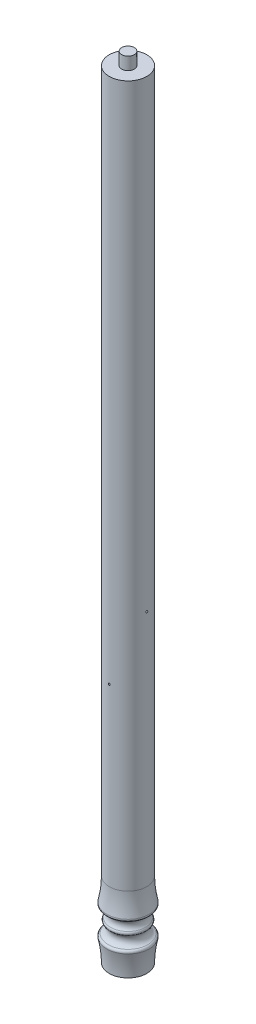
ISO-10303-21;
HEADER;
FILE_DESCRIPTION(('STEP AP214'),'2;1');
FILE_NAME('part.step','',(''),(''),'','','');
FILE_SCHEMA(('AUTOMOTIVE_DESIGN { 1 0 10303 214 1 1 1 1 }'));
ENDSEC;
DATA;
#1=APPLICATION_CONTEXT('core data for automotive mechanical design processes');
#2=APPLICATION_PROTOCOL_DEFINITION('international standard','automotive_design',2000,#1);
#3=PRODUCT_CONTEXT('',#1,'mechanical');
#4=PRODUCT('Part','Part','',(#3));
#5=PRODUCT_RELATED_PRODUCT_CATEGORY('part','',(#4));
#6=PRODUCT_DEFINITION_FORMATION('','',#4);
#7=PRODUCT_DEFINITION_CONTEXT('part definition',#1,'design');
#8=PRODUCT_DEFINITION('design','',#6,#7);
#9=PRODUCT_DEFINITION_SHAPE('','',#8);
#10=(LENGTH_UNIT() NAMED_UNIT(*) SI_UNIT(.MILLI.,.METRE.));
#11=(NAMED_UNIT(*) PLANE_ANGLE_UNIT() SI_UNIT($,.RADIAN.));
#12=(NAMED_UNIT(*) SI_UNIT($,.STERADIAN.) SOLID_ANGLE_UNIT());
#13=UNCERTAINTY_MEASURE_WITH_UNIT(LENGTH_MEASURE(1.E-05),#10,'distance_accuracy_value','');
#14=(GEOMETRIC_REPRESENTATION_CONTEXT(3) GLOBAL_UNCERTAINTY_ASSIGNED_CONTEXT((#13)) GLOBAL_UNIT_ASSIGNED_CONTEXT((#10,
#11,#12)) REPRESENTATION_CONTEXT('',''));
#15=CARTESIAN_POINT('',(0.,0.,0.));
#16=DIRECTION('',(0.,0.,1.));
#17=DIRECTION('',(1.,0.,0.));
#18=AXIS2_PLACEMENT_3D('',#15,#16,#17);
#19=CARTESIAN_POINT('',(6.35,800.1,0.));
#20=DIRECTION('',(0.,1.,0.));
#21=DIRECTION('',(0.,0.,1.));
#22=AXIS2_PLACEMENT_3D('',#19,#20,#21);
#23=PLANE('',#22);
#24=CARTESIAN_POINT('',(0.,800.1,0.));
#25=DIRECTION('',(0.,-1.,0.));
#26=DIRECTION('',(0.,0.,-1.));
#27=AXIS2_PLACEMENT_3D('',#24,#25,#26);
#28=CIRCLE('',#27,6.35);
#29=CARTESIAN_POINT('',(0.,800.1,-6.35));
#30=VERTEX_POINT('',#29);
#31=EDGE_CURVE('E45',#30,#30,#28,.T.);
#32=ORIENTED_EDGE('',*,*,#31,.F.);
#33=EDGE_LOOP('',(#32));
#34=FACE_BOUND('',#33,.T.);
#35=ADVANCED_FACE('F30',(#34),#23,.T.);
#36=CARTESIAN_POINT('',(0.,-55.,0.));
#37=DIRECTION('',(0.,-1.,0.));
#38=DIRECTION('',(0.,0.,-1.));
#39=AXIS2_PLACEMENT_3D('',#36,#37,#38);
#40=CYLINDRICAL_SURFACE('',#39,6.35);
#41=ORIENTED_EDGE('',*,*,#31,.T.);
#42=EDGE_LOOP('',(#41));
#43=FACE_BOUND('',#42,.T.);
#44=CARTESIAN_POINT('',(0.,787.4,0.));
#45=DIRECTION('',(0.,-1.,0.));
#46=DIRECTION('',(0.,0.,-1.));
#47=AXIS2_PLACEMENT_3D('',#44,#45,#46);
#48=CIRCLE('',#47,6.35);
#49=CARTESIAN_POINT('',(0.,787.4,-6.35));
#50=VERTEX_POINT('',#49);
#51=EDGE_CURVE('E49',#50,#50,#48,.T.);
#52=ORIENTED_EDGE('',*,*,#51,.F.);
#53=EDGE_LOOP('',(#52));
#54=FACE_BOUND('',#53,.T.);
#55=ADVANCED_FACE('F104',(#43,#54),#40,.T.);
#56=CARTESIAN_POINT('',(19.05,787.4,0.));
#57=DIRECTION('',(0.,1.,0.));
#58=DIRECTION('',(0.,0.,1.));
#59=AXIS2_PLACEMENT_3D('',#56,#57,#58);
#60=PLANE('',#59);
#61=ORIENTED_EDGE('',*,*,#51,.T.);
#62=EDGE_LOOP('',(#61));
#63=FACE_BOUND('',#62,.T.);
#64=CARTESIAN_POINT('',(0.,787.4,0.));
#65=DIRECTION('',(0.,-1.,0.));
#66=DIRECTION('',(0.,0.,-1.));
#67=AXIS2_PLACEMENT_3D('',#64,#65,#66);
#68=CIRCLE('',#67,19.05);
#69=CARTESIAN_POINT('',(0.,787.4,-19.05));
#70=VERTEX_POINT('',#69);
#71=EDGE_CURVE('E115',#70,#70,#68,.T.);
#72=ORIENTED_EDGE('',*,*,#71,.F.);
#73=EDGE_LOOP('',(#72));
#74=FACE_BOUND('',#73,.T.);
#75=ADVANCED_FACE('F99',(#63,#74),#60,.T.);
#76=CARTESIAN_POINT('',(0.,-55.,0.));
#77=DIRECTION('',(0.,-1.,0.));
#78=DIRECTION('',(0.,0.,-1.));
#79=AXIS2_PLACEMENT_3D('',#76,#77,#78);
#80=CYLINDRICAL_SURFACE('',#79,19.05);
#81=CARTESIAN_POINT('',(19.0241442373854,317.5,-0.992187499999998));
#82=CARTESIAN_POINT('',(19.0241445844981,317.555691040269,-0.992185043218346));
#83=CARTESIAN_POINT('',(19.0243914099017,317.611421499591,-0.987482880598128));
#84=CARTESIAN_POINT('',(19.0253522064706,317.721344788775,-0.968791831717693));
#85=CARTESIAN_POINT('',(19.0260667270266,317.775535731991,-0.954792023444037));
#86=CARTESIAN_POINT('',(19.0278817588493,317.880771746707,-0.91790780200389));
#87=CARTESIAN_POINT('',(19.0289820722649,317.93181841498,-0.895027942268089));
#88=CARTESIAN_POINT('',(19.0314444572828,318.029332847607,-0.841040141353861));
#89=CARTESIAN_POINT('',(19.0328064673575,318.075801684381,-0.809934133584558));
#90=CARTESIAN_POINT('',(19.035640462504,318.162905625914,-0.740339501141833));
#91=CARTESIAN_POINT('',(19.0371125510756,318.20353513275,-0.701843873817424));
#92=CARTESIAN_POINT('',(19.0399998546066,318.27775933255,-0.618576834785262));
#93=CARTESIAN_POINT('',(19.0414150672349,318.311353737422,-0.573805166193703));
#94=CARTESIAN_POINT('',(19.0440299566155,318.370569807011,-0.479227279740522));
#95=CARTESIAN_POINT('',(19.0452295142131,318.396187069847,-0.429418302243168));
#96=CARTESIAN_POINT('',(19.0472768660109,318.438693435084,-0.326199109710785));
#97=CARTESIAN_POINT('',(19.0481246630397,318.455582607674,-0.272788923639546));
#98=CARTESIAN_POINT('',(19.0493722619553,318.4801384693,-0.163935309032981));
#99=CARTESIAN_POINT('',(19.0497724736062,318.487813594265,-0.108493788296282));
#100=CARTESIAN_POINT('',(19.0500811779553,318.493749528879,0.00289203821470772));
#101=CARTESIAN_POINT('',(19.0499896747764,318.492010417462,0.0588363397695124));
#102=CARTESIAN_POINT('',(19.0493256053153,318.47917424011,0.16958255004882));
#103=CARTESIAN_POINT('',(19.0487535057648,318.468086253306,0.224385514287023));
#104=CARTESIAN_POINT('',(19.0471932164615,318.436881148761,0.331351237859812));
#105=CARTESIAN_POINT('',(19.0462050248553,318.416763990798,0.383513985432079));
#106=CARTESIAN_POINT('',(19.0439230534334,318.368061255084,0.483747787649828));
#107=CARTESIAN_POINT('',(19.0426291245274,318.339471544027,0.53181683042679));
#108=CARTESIAN_POINT('',(19.0398813805816,318.274638275899,0.622476732686119));
#109=CARTESIAN_POINT('',(19.0384275643113,318.238394659922,0.665067550003392));
#110=CARTESIAN_POINT('',(19.0355217132746,318.159231086143,0.74361496173048));
#111=CARTESIAN_POINT('',(19.0340696826742,318.116303250859,0.779563617494988));
#112=CARTESIAN_POINT('',(19.0313328350708,318.025017464577,0.843745091636823));
#113=CARTESIAN_POINT('',(19.0300480181152,317.976659512042,0.87197790782987));
#114=CARTESIAN_POINT('',(19.027790620048,317.875881366086,0.919925602894837));
#115=CARTESIAN_POINT('',(19.0268180500779,317.823461027796,0.939640177830436));
#116=CARTESIAN_POINT('',(19.0252952446916,317.716048317854,0.969986436610687));
#117=CARTESIAN_POINT('',(19.0247450058288,317.661055967198,0.980618194580323));
#118=CARTESIAN_POINT('',(19.0241295521151,317.550129431922,0.992487193400964));
#119=CARTESIAN_POINT('',(19.0240637682688,317.494196429555,0.993735455263747));
#120=CARTESIAN_POINT('',(19.0244231574489,317.382915523289,0.986830794194031));
#121=CARTESIAN_POINT('',(19.0248483287111,317.327567617287,0.978677905042497));
#122=CARTESIAN_POINT('',(19.0261411888976,317.219059017006,0.953211515392859));
#123=CARTESIAN_POINT('',(19.0270086339029,317.165897134556,0.935903064093415));
#124=CARTESIAN_POINT('',(19.0290880675672,317.063233039659,0.892621984222719));
#125=CARTESIAN_POINT('',(19.0303000583919,317.013730850218,0.866649301193308));
#126=CARTESIAN_POINT('',(19.0329333686741,316.91974063529,0.806748759969909));
#127=CARTESIAN_POINT('',(19.0343548823998,316.875257331588,0.772813501464365));
#128=CARTESIAN_POINT('',(19.0372463406283,316.792615113154,0.697961912101268));
#129=CARTESIAN_POINT('',(19.0387162854655,316.754456242102,0.657045533033007));
#130=CARTESIAN_POINT('',(19.0415405971984,316.685509015214,0.569345817653305));
#131=CARTESIAN_POINT('',(19.0428948516259,316.654727780214,0.522556879015713));
#132=CARTESIAN_POINT('',(19.0453335519248,316.601458278856,0.42446850609622));
#133=CARTESIAN_POINT('',(19.046417999045,316.578969974113,0.373169092693506));
#134=CARTESIAN_POINT('',(19.0481943335062,316.542937135282,0.267542414703479));
#135=CARTESIAN_POINT('',(19.0488864204454,316.529388053132,0.21321670510491));
#136=CARTESIAN_POINT('',(19.049800833078,316.51160337561,0.103057793331994));
#137=CARTESIAN_POINT('',(19.0500231617197,316.507367721783,0.0472246006214258));
#138=CARTESIAN_POINT('',(19.0499730147725,316.508330690854,-0.0642937334501295));
#139=CARTESIAN_POINT('',(19.0497011247923,316.51351814813,-0.119978971836129));
#140=CARTESIAN_POINT('',(19.0486942988733,316.533156994488,-0.229686785937022));
#141=CARTESIAN_POINT('',(19.04795936207,316.547608400865,-0.283709358547354));
#142=CARTESIAN_POINT('',(19.0461091152987,316.585362595864,-0.388560558652418));
#143=CARTESIAN_POINT('',(19.0449938032257,316.608665433465,-0.439389168471654));
#144=CARTESIAN_POINT('',(19.0425082060983,316.663459151626,-0.536413419752308));
#145=CARTESIAN_POINT('',(19.0411379286869,316.694949786752,-0.582609200028011));
#146=CARTESIAN_POINT('',(19.0382947482456,316.765265445288,-0.669112419537187));
#147=CARTESIAN_POINT('',(19.036821736537,316.80409831238,-0.709413479039008));
#148=CARTESIAN_POINT('',(19.0339398703215,316.887989815767,-0.782937242487251));
#149=CARTESIAN_POINT('',(19.0325310316757,316.933049980237,-0.816158203878492));
#150=CARTESIAN_POINT('',(19.0299354053937,317.028154846084,-0.874595691160268));
#151=CARTESIAN_POINT('',(19.0287488416472,317.078204496294,-0.899804163964586));
#152=CARTESIAN_POINT('',(19.0267350873092,317.181794690062,-0.94142991912283));
#153=CARTESIAN_POINT('',(19.0259074729913,317.235331031335,-0.957857572260165));
#154=CARTESIAN_POINT('',(19.0249237977219,317.324332699273,-0.977152274060893));
#155=CARTESIAN_POINT('',(19.0246327544357,317.359221714481,-0.982783271460183));
#156=CARTESIAN_POINT('',(19.0242428643261,317.429401872141,-0.990301661453891));
#157=CARTESIAN_POINT('',(19.024144017323,317.464693014217,-0.99218905754955));
#158=CARTESIAN_POINT('',(19.0241442373854,317.5,-0.992187499999998));
#159=B_SPLINE_CURVE_WITH_KNOTS('',3,(#81,#82,#83,#84,#85,#86,#87,#88,#89,#90,#91,#92,#93,#94,
#95,#96,#97,#98,#99,#100,#101,#102,#103,#104,#105,#106,#107,#108,#109,#110,#111,#112,#113,#114,
#115,#116,#117,#118,#119,#120,#121,#122,#123,#124,#125,#126,#127,#128,#129,#130,#131,#132,#133,
#134,#135,#136,#137,#138,#139,#140,#141,#142,#143,#144,#145,#146,#147,#148,#149,#150,#151,#152,
#153,#154,#155,#156,#157,#158),.UNSPECIFIED.,.T.,.F.,(4,2,2,2,2,2,2,2,2,2,2,2,2,2,2,2,2,2,2,2,2,
2,2,2,2,2,2,2,2,2,2,2,2,2,2,2,2,2,4),(0.,0.16694423544984,0.334084929236096,0.501140031153447,
0.668155904594911,0.835330836242236,1.0025126125034,1.16978647882011,1.33705899994749,
1.50417825750049,1.6712961138465,1.8382518609178,2.00520835172117,2.17224642611249,
2.33928578609434,2.50652351637457,2.67376129399814,2.84100503828039,3.00824741767131,
3.17529333844775,3.34233865898338,3.50929195163698,3.67624629367851,3.84335641979018,
4.01046769998928,4.1777396309278,4.34501078759796,4.51219677491249,4.67938171289956,
4.84636867951513,5.01335595791306,5.18034416034277,5.34732735777983,5.51448996120048,
5.68169365932361,5.84906488079929,6.0162379854965,6.12207733114081,6.22791657779776),.UNSPECIFIED.);
#160=CARTESIAN_POINT('',(19.0241442373854,317.5,-0.992187499999998));
#161=VERTEX_POINT('',#160);
#162=EDGE_CURVE('E10',#161,#161,#159,.T.);
#163=ORIENTED_EDGE('',*,*,#162,.F.);
#164=EDGE_LOOP('',(#163));
#165=FACE_BOUND('',#164,.T.);
#166=CARTESIAN_POINT('',(0.992187499999998,254.,19.0241442373854));
#167=CARTESIAN_POINT('',(0.992185043218346,254.055691040269,19.0241445844981));
#168=CARTESIAN_POINT('',(0.987482880598128,254.111421499591,19.0243914099017));
#169=CARTESIAN_POINT('',(0.968791831717693,254.221344788775,19.0253522064706));
#170=CARTESIAN_POINT('',(0.954792023444037,254.275535731991,19.0260667270266));
#171=CARTESIAN_POINT('',(0.91790780200389,254.380771746707,19.0278817588493));
#172=CARTESIAN_POINT('',(0.895027942268089,254.43181841498,19.0289820722649));
#173=CARTESIAN_POINT('',(0.841040141353861,254.529332847607,19.0314444572828));
#174=CARTESIAN_POINT('',(0.809934133584558,254.575801684381,19.0328064673575));
#175=CARTESIAN_POINT('',(0.740339501141833,254.662905625914,19.035640462504));
#176=CARTESIAN_POINT('',(0.701843873817424,254.70353513275,19.0371125510756));
#177=CARTESIAN_POINT('',(0.618576834785262,254.77775933255,19.0399998546066));
#178=CARTESIAN_POINT('',(0.573805166193703,254.811353737422,19.0414150672349));
#179=CARTESIAN_POINT('',(0.479227279740522,254.870569807011,19.0440299566155));
#180=CARTESIAN_POINT('',(0.429418302243168,254.896187069847,19.0452295142131));
#181=CARTESIAN_POINT('',(0.326199109710785,254.938693435084,19.0472768660109));
#182=CARTESIAN_POINT('',(0.272788923639546,254.955582607674,19.0481246630397));
#183=CARTESIAN_POINT('',(0.163935309032981,254.9801384693,19.0493722619553));
#184=CARTESIAN_POINT('',(0.108493788296282,254.987813594265,19.0497724736062));
#185=CARTESIAN_POINT('',(-0.00289203821470768,254.993749528879,19.0500811779553));
#186=CARTESIAN_POINT('',(-0.0588363397695124,254.992010417462,19.0499896747764));
#187=CARTESIAN_POINT('',(-0.16958255004882,254.97917424011,19.0493256053153));
#188=CARTESIAN_POINT('',(-0.224385514287023,254.968086253306,19.0487535057648));
#189=CARTESIAN_POINT('',(-0.331351237859812,254.936881148761,19.0471932164615));
#190=CARTESIAN_POINT('',(-0.383513985432079,254.916763990798,19.0462050248553));
#191=CARTESIAN_POINT('',(-0.483747787649828,254.868061255084,19.0439230534334));
#192=CARTESIAN_POINT('',(-0.53181683042679,254.839471544027,19.0426291245274));
#193=CARTESIAN_POINT('',(-0.622476732686119,254.774638275899,19.0398813805816));
#194=CARTESIAN_POINT('',(-0.665067550003392,254.738394659922,19.0384275643113));
#195=CARTESIAN_POINT('',(-0.743614961730481,254.659231086143,19.0355217132746));
#196=CARTESIAN_POINT('',(-0.779563617494988,254.616303250859,19.0340696826742));
#197=CARTESIAN_POINT('',(-0.843745091636823,254.525017464577,19.0313328350708));
#198=CARTESIAN_POINT('',(-0.87197790782987,254.476659512042,19.0300480181152));
#199=CARTESIAN_POINT('',(-0.919925602894829,254.375881366086,19.027790620048));
#200=CARTESIAN_POINT('',(-0.939640177830424,254.323461027796,19.0268180500779));
#201=CARTESIAN_POINT('',(-0.969986436610681,254.216048317855,19.0252952446916));
#202=CARTESIAN_POINT('',(-0.980618194580321,254.161055967198,19.0247450058288));
#203=CARTESIAN_POINT('',(-0.992487193400963,254.050129431922,19.0241295521151));
#204=CARTESIAN_POINT('',(-0.993735455263747,253.994196429555,19.0240637682688));
#205=CARTESIAN_POINT('',(-0.986830794194031,253.882915523289,19.0244231574489));
#206=CARTESIAN_POINT('',(-0.978677905042496,253.827567617287,19.0248483287111));
#207=CARTESIAN_POINT('',(-0.953211515392855,253.719059017006,19.0261411888976));
#208=CARTESIAN_POINT('',(-0.935903064093406,253.665897134556,19.0270086339029));
#209=CARTESIAN_POINT('',(-0.892621984222704,253.563233039659,19.0290880675672));
#210=CARTESIAN_POINT('',(-0.866649301193299,253.513730850218,19.0303000583919));
#211=CARTESIAN_POINT('',(-0.806748759969908,253.41974063529,19.0329333686741));
#212=CARTESIAN_POINT('',(-0.772813501464365,253.375257331588,19.0343548823998));
#213=CARTESIAN_POINT('',(-0.697961912101268,253.292615113154,19.0372463406283));
#214=CARTESIAN_POINT('',(-0.657045533033007,253.254456242102,19.0387162854655));
#215=CARTESIAN_POINT('',(-0.569345817653305,253.185509015214,19.0415405971984));
#216=CARTESIAN_POINT('',(-0.522556879015713,253.154727780214,19.0428948516259));
#217=CARTESIAN_POINT('',(-0.42446850609622,253.101458278856,19.0453335519248));
#218=CARTESIAN_POINT('',(-0.373169092693506,253.078969974113,19.046417999045));
#219=CARTESIAN_POINT('',(-0.267542414703482,253.042937135282,19.0481943335062));
#220=CARTESIAN_POINT('',(-0.213216705104916,253.029388053132,19.0488864204454));
#221=CARTESIAN_POINT('',(-0.103057793332,253.01160337561,19.049800833078));
#222=CARTESIAN_POINT('',(-0.0472246006214285,253.007367721783,19.0500231617197));
#223=CARTESIAN_POINT('',(0.0642937334501265,253.008330690854,19.0499730147725));
#224=CARTESIAN_POINT('',(0.119978971836122,253.01351814813,19.0497011247923));
#225=CARTESIAN_POINT('',(0.229686785937016,253.033156994488,19.0486942988733));
#226=CARTESIAN_POINT('',(0.283709358547351,253.047608400865,19.04795936207));
#227=CARTESIAN_POINT('',(0.388560558652419,253.085362595864,19.0461091152987));
#228=CARTESIAN_POINT('',(0.439389168471654,253.108665433465,19.0449938032257));
#229=CARTESIAN_POINT('',(0.536413419752309,253.163459151626,19.0425082060983));
#230=CARTESIAN_POINT('',(0.582609200028011,253.194949786752,19.0411379286869));
#231=CARTESIAN_POINT('',(0.669112419537187,253.265265445288,19.0382947482456));
#232=CARTESIAN_POINT('',(0.709413479039009,253.30409831238,19.036821736537));
#233=CARTESIAN_POINT('',(0.782937242487251,253.387989815767,19.0339398703215));
#234=CARTESIAN_POINT('',(0.816158203878492,253.433049980237,19.0325310316757));
#235=CARTESIAN_POINT('',(0.874595691160267,253.528154846084,19.0299354053937));
#236=CARTESIAN_POINT('',(0.899804163964586,253.578204496294,19.0287488416472));
#237=CARTESIAN_POINT('',(0.94142991912283,253.681794690062,19.0267350873092));
#238=CARTESIAN_POINT('',(0.957857572260165,253.735331031335,19.0259074729913));
#239=CARTESIAN_POINT('',(0.977152274060893,253.824332699273,19.0249237977219));
#240=CARTESIAN_POINT('',(0.982783271460183,253.859221714481,19.0246327544357));
#241=CARTESIAN_POINT('',(0.990301661453891,253.929401872141,19.0242428643261));
#242=CARTESIAN_POINT('',(0.99218905754955,253.964693014217,19.024144017323));
#243=CARTESIAN_POINT('',(0.992187499999998,254.,19.0241442373854));
#244=B_SPLINE_CURVE_WITH_KNOTS('',3,(#166,#167,#168,#169,#170,#171,#172,#173,#174,#175,#176,
#177,#178,#179,#180,#181,#182,#183,#184,#185,#186,#187,#188,#189,#190,#191,#192,#193,#194,#195,
#196,#197,#198,#199,#200,#201,#202,#203,#204,#205,#206,#207,#208,#209,#210,#211,#212,#213,#214,
#215,#216,#217,#218,#219,#220,#221,#222,#223,#224,#225,#226,#227,#228,#229,#230,#231,#232,#233,
#234,#235,#236,#237,#238,#239,#240,#241,#242,#243),.UNSPECIFIED.,.T.,.F.,(4,2,2,2,2,2,2,2,2,2,2,
2,2,2,2,2,2,2,2,2,2,2,2,2,2,2,2,2,2,2,2,2,2,2,2,2,2,2,4),(0.,0.16694423544984,0.334084929236096,
0.501140031153447,0.668155904594911,0.835330836242236,1.0025126125034,1.16978647882011,
1.33705899994749,1.50417825750049,1.6712961138465,1.8382518609178,2.00520835172117,
2.17224642611249,2.33928578609434,2.50652351637457,2.67376129399814,2.84100503828033,
3.00824741767131,3.17529333844775,3.34233865898338,3.50929195163704,3.67624629367851,
3.84335641979018,4.01046769998928,4.1777396309278,4.34501078759796,4.51219677491249,
4.67938171289957,4.84636867951512,5.01335595791306,5.18034416034277,5.34732735777983,
5.51448996120048,5.68169365932361,5.84906488079929,6.0162379854965,6.12207733114082,
6.22791657779776),.UNSPECIFIED.);
#245=CARTESIAN_POINT('',(0.992187499999998,254.,19.0241442373854));
#246=VERTEX_POINT('',#245);
#247=EDGE_CURVE('E41',#246,#246,#244,.T.);
#248=ORIENTED_EDGE('',*,*,#247,.F.);
#249=EDGE_LOOP('',(#248));
#250=FACE_BOUND('',#249,.T.);
#251=ORIENTED_EDGE('',*,*,#71,.T.);
#252=EDGE_LOOP('',(#251));
#253=FACE_BOUND('',#252,.T.);
#254=CARTESIAN_POINT('',(0.,76.2,0.));
#255=DIRECTION('',(0.,-1.,0.));
#256=DIRECTION('',(0.,0.,-1.));
#257=AXIS2_PLACEMENT_3D('',#254,#255,#256);
#258=CIRCLE('',#257,19.05);
#259=CARTESIAN_POINT('',(0.,76.2,-19.05));
#260=VERTEX_POINT('',#259);
#261=EDGE_CURVE('E117',#260,#260,#258,.T.);
#262=ORIENTED_EDGE('',*,*,#261,.F.);
#263=EDGE_LOOP('',(#262));
#264=FACE_BOUND('',#263,.T.);
#265=ADVANCED_FACE('F56',(#165,#250,#253,#264),#80,.T.);
#266=CARTESIAN_POINT('',(0.,76.2,0.));
#267=DIRECTION('',(0.,-1.,0.));
#268=DIRECTION('',(0.,0.,-1.));
#269=AXIS2_PLACEMENT_3D('',#266,#267,#268);
#270=TOROIDAL_SURFACE('',#269,122.2375,103.1875);
#271=ORIENTED_EDGE('',*,*,#261,.T.);
#272=EDGE_LOOP('',(#271));
#273=FACE_BOUND('',#272,.T.);
#274=CARTESIAN_POINT('',(0.,53.348293437608,0.));
#275=DIRECTION('',(0.,-1.,0.));
#276=DIRECTION('',(0.,0.,-1.));
#277=AXIS2_PLACEMENT_3D('',#274,#275,#276);
#278=CIRCLE('',#277,21.6121569524539);
#279=CARTESIAN_POINT('',(0.,53.348293437608,-21.6121569524539));
#280=VERTEX_POINT('',#279);
#281=EDGE_CURVE('E121',#280,#280,#278,.T.);
#282=ORIENTED_EDGE('',*,*,#281,.F.);
#283=EDGE_LOOP('',(#282));
#284=FACE_BOUND('',#283,.T.);
#285=ADVANCED_FACE('F92',(#273,#284),#270,.F.);
#286=CARTESIAN_POINT('',(0.,52.7857898914568,0.));
#287=DIRECTION('',(0.,-1.,0.));
#288=DIRECTION('',(0.,0.,-1.));
#289=AXIS2_PLACEMENT_3D('',#286,#287,#288);
#290=TOROIDAL_SURFACE('',#289,19.1352254312836,2.54);
#291=ORIENTED_EDGE('',*,*,#281,.T.);
#292=EDGE_LOOP('',(#291));
#293=FACE_BOUND('',#292,.T.);
#294=CARTESIAN_POINT('',(0.,50.4041356367548,0.));
#295=DIRECTION('',(0.,-1.,0.));
#296=DIRECTION('',(0.,0.,-1.));
#297=AXIS2_PLACEMENT_3D('',#294,#295,#296);
#298=CIRCLE('',#297,20.0180181652025);
#299=CARTESIAN_POINT('',(0.,50.4041356367548,-20.0180181652025));
#300=VERTEX_POINT('',#299);
#301=EDGE_CURVE('E124',#300,#300,#298,.T.);
#302=ORIENTED_EDGE('',*,*,#301,.F.);
#303=EDGE_LOOP('',(#302));
#304=FACE_BOUND('',#303,.T.);
#305=ADVANCED_FACE('F89',(#293,#304),#290,.T.);
#306=CARTESIAN_POINT('',(0.,44.45,0.));
#307=DIRECTION('',(0.,-1.,0.));
#308=DIRECTION('',(0.,0.,-1.));
#309=AXIS2_PLACEMENT_3D('',#306,#307,#308);
#310=TOROIDAL_SURFACE('',#309,22.225,6.35);
#311=ORIENTED_EDGE('',*,*,#301,.T.);
#312=EDGE_LOOP('',(#311));
#313=FACE_BOUND('',#312,.T.);
#314=CARTESIAN_POINT('',(0.,39.9142857142857,0.));
#315=DIRECTION('',(0.,-1.,0.));
#316=DIRECTION('',(0.,0.,-1.));
#317=AXIS2_PLACEMENT_3D('',#314,#315,#316);
#318=CIRCLE('',#317,17.7809257523791);
#319=CARTESIAN_POINT('',(0.,39.9142857142857,-17.7809257523791));
#320=VERTEX_POINT('',#319);
#321=EDGE_CURVE('E127',#320,#320,#318,.T.);
#322=ORIENTED_EDGE('',*,*,#321,.F.);
#323=EDGE_LOOP('',(#322));
#324=FACE_BOUND('',#323,.T.);
#325=ADVANCED_FACE('F85',(#313,#324),#310,.F.);
#326=CARTESIAN_POINT('',(0.,38.1,0.));
#327=DIRECTION('',(0.,-1.,0.));
#328=DIRECTION('',(0.,0.,-1.));
#329=AXIS2_PLACEMENT_3D('',#326,#327,#328);
#330=TOROIDAL_SURFACE('',#329,16.0032960533307,2.54);
#331=ORIENTED_EDGE('',*,*,#321,.T.);
#332=EDGE_LOOP('',(#331));
#333=FACE_BOUND('',#332,.T.);
#334=CARTESIAN_POINT('',(0.,36.2857142857143,0.));
#335=DIRECTION('',(0.,-1.,0.));
#336=DIRECTION('',(0.,0.,-1.));
#337=AXIS2_PLACEMENT_3D('',#334,#335,#336);
#338=CIRCLE('',#337,17.7809257523791);
#339=CARTESIAN_POINT('',(0.,36.2857142857143,-17.7809257523791));
#340=VERTEX_POINT('',#339);
#341=EDGE_CURVE('E130',#340,#340,#338,.T.);
#342=ORIENTED_EDGE('',*,*,#341,.F.);
#343=EDGE_LOOP('',(#342));
#344=FACE_BOUND('',#343,.T.);
#345=ADVANCED_FACE('F81',(#333,#344),#330,.T.);
#346=CARTESIAN_POINT('',(0.,31.75,0.));
#347=DIRECTION('',(0.,-1.,0.));
#348=DIRECTION('',(0.,0.,-1.));
#349=AXIS2_PLACEMENT_3D('',#346,#347,#348);
#350=TOROIDAL_SURFACE('',#349,22.225,6.34999999999999);
#351=ORIENTED_EDGE('',*,*,#341,.T.);
#352=EDGE_LOOP('',(#351));
#353=FACE_BOUND('',#352,.T.);
#354=CARTESIAN_POINT('',(0.,25.7958643632452,0.));
#355=DIRECTION('',(0.,-1.,0.));
#356=DIRECTION('',(0.,0.,-1.));
#357=AXIS2_PLACEMENT_3D('',#354,#355,#356);
#358=CIRCLE('',#357,20.0180181652026);
#359=CARTESIAN_POINT('',(0.,25.7958643632452,-20.0180181652026));
#360=VERTEX_POINT('',#359);
#361=EDGE_CURVE('E133',#360,#360,#358,.T.);
#362=ORIENTED_EDGE('',*,*,#361,.F.);
#363=EDGE_LOOP('',(#362));
#364=FACE_BOUND('',#363,.T.);
#365=ADVANCED_FACE('F77',(#353,#364),#350,.F.);
#366=CARTESIAN_POINT('',(0.,23.4142101085433,0.));
#367=DIRECTION('',(0.,-1.,0.));
#368=DIRECTION('',(0.,0.,-1.));
#369=AXIS2_PLACEMENT_3D('',#366,#367,#368);
#370=TOROIDAL_SURFACE('',#369,19.1352254312836,2.54);
#371=ORIENTED_EDGE('',*,*,#361,.T.);
#372=EDGE_LOOP('',(#371));
#373=FACE_BOUND('',#372,.T.);
#374=CARTESIAN_POINT('',(0.,22.8517065623921,0.));
#375=DIRECTION('',(0.,-1.,0.));
#376=DIRECTION('',(0.,0.,-1.));
#377=AXIS2_PLACEMENT_3D('',#374,#375,#376);
#378=CIRCLE('',#377,21.6121569524539);
#379=CARTESIAN_POINT('',(0.,22.8517065623921,-21.6121569524539));
#380=VERTEX_POINT('',#379);
#381=EDGE_CURVE('E136',#380,#380,#378,.T.);
#382=ORIENTED_EDGE('',*,*,#381,.F.);
#383=EDGE_LOOP('',(#382));
#384=FACE_BOUND('',#383,.T.);
#385=ADVANCED_FACE('F73',(#373,#384),#370,.T.);
#386=CARTESIAN_POINT('',(0.,0.,0.));
#387=DIRECTION('',(0.,-1.,0.));
#388=DIRECTION('',(0.,0.,-1.));
#389=AXIS2_PLACEMENT_3D('',#386,#387,#388);
#390=TOROIDAL_SURFACE('',#389,122.2375,103.1875);
#391=ORIENTED_EDGE('',*,*,#381,.T.);
#392=EDGE_LOOP('',(#391));
#393=FACE_BOUND('',#392,.T.);
#394=CARTESIAN_POINT('',(0.,0.,0.));
#395=DIRECTION('',(0.,-1.,0.));
#396=DIRECTION('',(0.,0.,-1.));
#397=AXIS2_PLACEMENT_3D('',#394,#395,#396);
#398=CIRCLE('',#397,19.05);
#399=CARTESIAN_POINT('',(0.,0.,-19.05));
#400=VERTEX_POINT('',#399);
#401=EDGE_CURVE('E139',#400,#400,#398,.T.);
#402=ORIENTED_EDGE('',*,*,#401,.F.);
#403=EDGE_LOOP('',(#402));
#404=FACE_BOUND('',#403,.T.);
#405=ADVANCED_FACE('F69',(#393,#404),#390,.F.);
#406=CARTESIAN_POINT('',(0.,0.,0.));
#407=DIRECTION('',(0.,-1.,0.));
#408=DIRECTION('',(0.,0.,-1.));
#409=AXIS2_PLACEMENT_3D('',#406,#407,#408);
#410=PLANE('',#409);
#411=ORIENTED_EDGE('',*,*,#401,.T.);
#412=EDGE_LOOP('',(#411));
#413=FACE_BOUND('',#412,.T.);
#414=ADVANCED_FACE('F66',(#413),#410,.T.);
#415=CARTESIAN_POINT('',(0.,254.,3.54366996216587));
#416=DIRECTION('',(0.,0.,1.));
#417=DIRECTION('',(1.,0.,0.));
#418=AXIS2_PLACEMENT_3D('',#415,#416,#417);
#419=CYLINDRICAL_SURFACE('',#418,0.992187499999998);
#420=ORIENTED_EDGE('',*,*,#247,.T.);
#421=EDGE_LOOP('',(#420));
#422=FACE_BOUND('',#421,.T.);
#423=CARTESIAN_POINT('',(0.,254.,6.35));
#424=DIRECTION('',(0.,0.,1.));
#425=DIRECTION('',(1.,0.,0.));
#426=AXIS2_PLACEMENT_3D('',#423,#424,#425);
#427=CIRCLE('',#426,0.992187499999998);
#428=CARTESIAN_POINT('',(0.992187499999998,254.,6.35));
#429=VERTEX_POINT('',#428);
#430=EDGE_CURVE('E142',#429,#429,#427,.F.);
#431=ORIENTED_EDGE('',*,*,#430,.T.);
#432=EDGE_LOOP('',(#431));
#433=FACE_BOUND('',#432,.T.);
#434=ADVANCED_FACE('F60',(#422,#433),#419,.F.);
#435=CARTESIAN_POINT('',(0.,0.,6.35));
#436=DIRECTION('',(0.,0.,1.));
#437=DIRECTION('',(1.,0.,0.));
#438=AXIS2_PLACEMENT_3D('',#435,#436,#437);
#439=PLANE('',#438);
#440=ORIENTED_EDGE('',*,*,#430,.F.);
#441=EDGE_LOOP('',(#440));
#442=FACE_BOUND('',#441,.T.);
#443=ADVANCED_FACE('F65',(#442),#439,.T.);
#444=CARTESIAN_POINT('',(3.54366996216587,317.5,0.));
#445=DIRECTION('',(1.,0.,0.));
#446=DIRECTION('',(0.,0.,-1.));
#447=AXIS2_PLACEMENT_3D('',#444,#445,#446);
#448=CYLINDRICAL_SURFACE('',#447,0.992187499999998);
#449=ORIENTED_EDGE('',*,*,#162,.T.);
#450=EDGE_LOOP('',(#449));
#451=FACE_BOUND('',#450,.T.);
#452=CARTESIAN_POINT('',(6.35,317.5,0.));
#453=DIRECTION('',(1.,0.,0.));
#454=DIRECTION('',(0.,0.,-1.));
#455=AXIS2_PLACEMENT_3D('',#452,#453,#454);
#456=CIRCLE('',#455,0.992187499999998);
#457=CARTESIAN_POINT('',(6.35,317.5,-0.992187499999998));
#458=VERTEX_POINT('',#457);
#459=EDGE_CURVE('E145',#458,#458,#456,.F.);
#460=ORIENTED_EDGE('',*,*,#459,.T.);
#461=EDGE_LOOP('',(#460));
#462=FACE_BOUND('',#461,.T.);
#463=ADVANCED_FACE('F149',(#451,#462),#448,.F.);
#464=CARTESIAN_POINT('',(6.35,0.,0.));
#465=DIRECTION('',(1.,0.,0.));
#466=DIRECTION('',(0.,0.,-1.));
#467=AXIS2_PLACEMENT_3D('',#464,#465,#466);
#468=PLANE('',#467);
#469=ORIENTED_EDGE('',*,*,#459,.F.);
#470=EDGE_LOOP('',(#469));
#471=FACE_BOUND('',#470,.T.);
#472=ADVANCED_FACE('F151',(#471),#468,.T.);
#473=CLOSED_SHELL('',(#35,#55,#75,#265,#285,#305,#325,#345,#365,#385,#405,#414,#434,#443,#463,#472));
#474=MANIFOLD_SOLID_BREP('B2',#473);
#475=ADVANCED_BREP_SHAPE_REPRESENTATION('',(#18,#474),#14);
#476=SHAPE_DEFINITION_REPRESENTATION(#9,#475);
ENDSEC;
END-ISO-10303-21;
